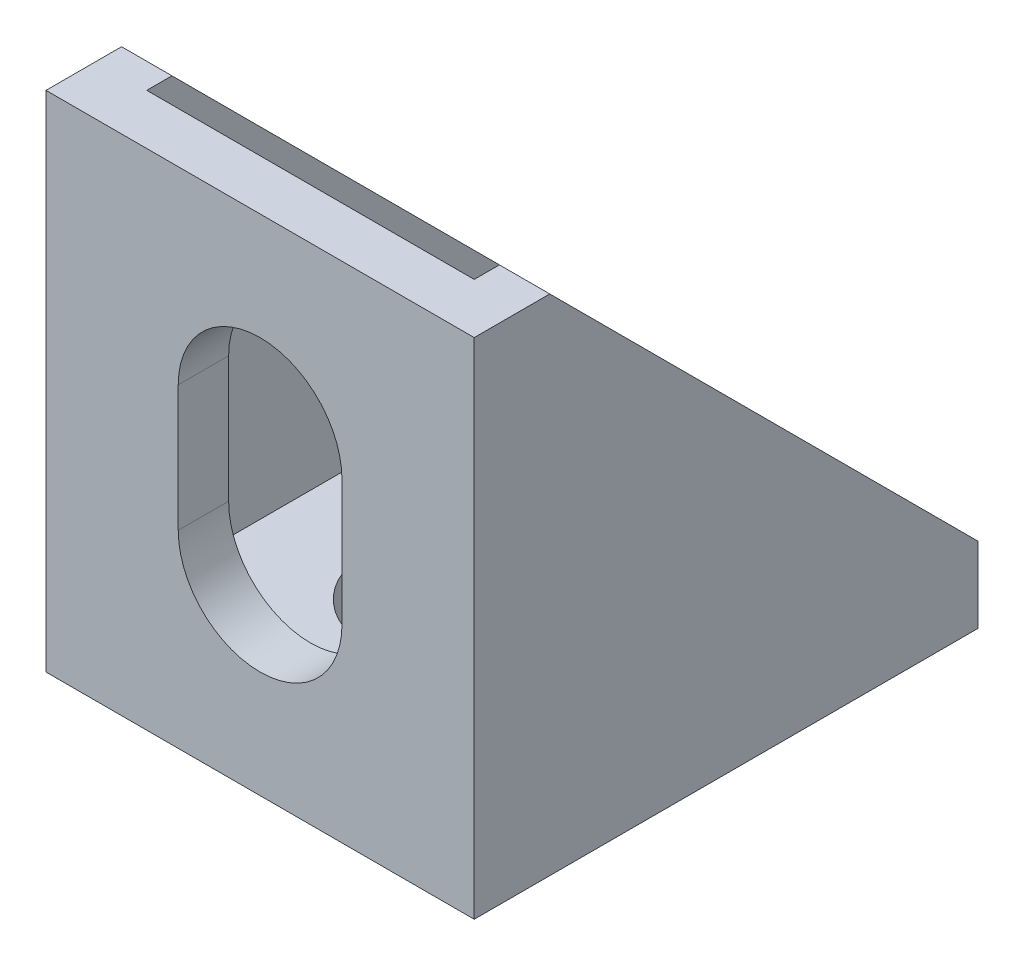
ISO-10303-21;
HEADER;
FILE_DESCRIPTION(('STEP AP214'),'2;1');
FILE_NAME('part.step','',(''),(''),'','','');
FILE_SCHEMA(('AUTOMOTIVE_DESIGN { 1 0 10303 214 1 1 1 1 }'));
ENDSEC;
DATA;
#1=APPLICATION_CONTEXT('core data for automotive mechanical design processes');
#2=APPLICATION_PROTOCOL_DEFINITION('international standard','automotive_design',2000,#1);
#3=PRODUCT_CONTEXT('',#1,'mechanical');
#4=PRODUCT('Part','Part','',(#3));
#5=PRODUCT_RELATED_PRODUCT_CATEGORY('part','',(#4));
#6=PRODUCT_DEFINITION_FORMATION('','',#4);
#7=PRODUCT_DEFINITION_CONTEXT('part definition',#1,'design');
#8=PRODUCT_DEFINITION('design','',#6,#7);
#9=PRODUCT_DEFINITION_SHAPE('','',#8);
#10=(LENGTH_UNIT() NAMED_UNIT(*) SI_UNIT(.MILLI.,.METRE.));
#11=(NAMED_UNIT(*) PLANE_ANGLE_UNIT() SI_UNIT($,.RADIAN.));
#12=(NAMED_UNIT(*) SI_UNIT($,.STERADIAN.) SOLID_ANGLE_UNIT());
#13=UNCERTAINTY_MEASURE_WITH_UNIT(LENGTH_MEASURE(1.E-05),#10,'distance_accuracy_value','');
#14=(GEOMETRIC_REPRESENTATION_CONTEXT(3) GLOBAL_UNCERTAINTY_ASSIGNED_CONTEXT((#13)) GLOBAL_UNIT_ASSIGNED_CONTEXT((#10,
#11,#12)) REPRESENTATION_CONTEXT('',''));
#15=CARTESIAN_POINT('',(0.,0.,0.));
#16=DIRECTION('',(0.,0.,1.));
#17=DIRECTION('',(1.,0.,0.));
#18=AXIS2_PLACEMENT_3D('',#15,#16,#17);
#19=CARTESIAN_POINT('',(8.5,3.,-20.));
#20=DIRECTION('',(0.,-0.707106781186548,0.707106781186548));
#21=DIRECTION('',(0.,-0.707106781186548,-0.707106781186548));
#22=AXIS2_PLACEMENT_3D('',#19,#20,#21);
#23=PLANE('',#22);
#24=DIRECTION('',(-1.,0.,0.));
#25=VECTOR('',#24,1.);
#26=CARTESIAN_POINT('',(8.5,3.,-20.));
#27=LINE('',#26,#25);
#28=CARTESIAN_POINT('',(8.5,3.,-20.));
#29=VERTEX_POINT('',#28);
#30=CARTESIAN_POINT('',(6.5,3.,-20.));
#31=VERTEX_POINT('',#30);
#32=EDGE_CURVE('E278',#29,#31,#27,.T.);
#33=ORIENTED_EDGE('',*,*,#32,.T.);
#34=DIRECTION('',(0.,0.707106781186548,0.707106781186548));
#35=VECTOR('',#34,1.);
#36=CARTESIAN_POINT('',(6.5,3.,-20.));
#37=LINE('',#36,#35);
#38=CARTESIAN_POINT('',(6.5,20.,-3.));
#39=VERTEX_POINT('',#38);
#40=EDGE_CURVE('E251',#31,#39,#37,.T.);
#41=ORIENTED_EDGE('',*,*,#40,.T.);
#42=DIRECTION('',(-1.,0.,0.));
#43=VECTOR('',#42,1.);
#44=CARTESIAN_POINT('',(8.5,20.,-3.));
#45=LINE('',#44,#43);
#46=CARTESIAN_POINT('',(8.5,20.,-3.));
#47=VERTEX_POINT('',#46);
#48=EDGE_CURVE('E12',#47,#39,#45,.T.);
#49=ORIENTED_EDGE('',*,*,#48,.F.);
#50=DIRECTION('',(0.,0.707106781186547,0.707106781186547));
#51=VECTOR('',#50,1.);
#52=CARTESIAN_POINT('',(8.5,3.,-20.));
#53=LINE('',#52,#51);
#54=EDGE_CURVE('E255',#29,#47,#53,.T.);
#55=ORIENTED_EDGE('',*,*,#54,.F.);
#56=EDGE_LOOP('',(#33,#41,#49,#55));
#57=FACE_BOUND('',#56,.T.);
#58=ADVANCED_FACE('F39',(#57),#23,.F.);
#59=CARTESIAN_POINT('',(-6.5,20.,-3.));
#60=VERTEX_POINT('',#59);
#61=CARTESIAN_POINT('',(-8.5,20.,-3.));
#62=VERTEX_POINT('',#61);
#63=EDGE_CURVE('E47',#60,#62,#45,.T.);
#64=ORIENTED_EDGE('',*,*,#63,.F.);
#65=DIRECTION('',(0.,-0.707106781186548,-0.707106781186548));
#66=VECTOR('',#65,1.);
#67=CARTESIAN_POINT('',(-6.5,3.,-20.));
#68=LINE('',#67,#66);
#69=CARTESIAN_POINT('',(-6.5,3.,-20.));
#70=VERTEX_POINT('',#69);
#71=EDGE_CURVE('E248',#60,#70,#68,.T.);
#72=ORIENTED_EDGE('',*,*,#71,.T.);
#73=CARTESIAN_POINT('',(-8.5,3.,-20.));
#74=VERTEX_POINT('',#73);
#75=EDGE_CURVE('E267',#70,#74,#27,.T.);
#76=ORIENTED_EDGE('',*,*,#75,.T.);
#77=DIRECTION('',(0.,0.707106781186547,0.707106781186547));
#78=VECTOR('',#77,1.);
#79=CARTESIAN_POINT('',(-8.5,3.,-20.));
#80=LINE('',#79,#78);
#81=EDGE_CURVE('E254',#74,#62,#80,.T.);
#82=ORIENTED_EDGE('',*,*,#81,.T.);
#83=EDGE_LOOP('',(#64,#72,#76,#82));
#84=FACE_BOUND('',#83,.T.);
#85=ADVANCED_FACE('F41',(#84),#23,.F.);
#86=CARTESIAN_POINT('',(8.5,20.,-3.));
#87=DIRECTION('',(0.,-1.,0.));
#88=DIRECTION('',(0.,0.,-1.));
#89=AXIS2_PLACEMENT_3D('',#86,#87,#88);
#90=PLANE('',#89);
#91=ORIENTED_EDGE('',*,*,#48,.T.);
#92=DIRECTION('',(0.,0.,-1.));
#93=VECTOR('',#92,1.);
#94=CARTESIAN_POINT('',(6.5,20.,21.4009345590327));
#95=LINE('',#94,#93);
#96=CARTESIAN_POINT('',(6.5,20.,-2.));
#97=VERTEX_POINT('',#96);
#98=EDGE_CURVE('E231',#97,#39,#95,.T.);
#99=ORIENTED_EDGE('',*,*,#98,.F.);
#100=DIRECTION('',(-1.,0.,0.));
#101=VECTOR('',#100,1.);
#102=CARTESIAN_POINT('',(6.5,20.,-2.));
#103=LINE('',#102,#101);
#104=CARTESIAN_POINT('',(-6.5,20.,-2.));
#105=VERTEX_POINT('',#104);
#106=EDGE_CURVE('E230',#97,#105,#103,.T.);
#107=ORIENTED_EDGE('',*,*,#106,.T.);
#108=DIRECTION('',(0.,0.,-1.));
#109=VECTOR('',#108,1.);
#110=CARTESIAN_POINT('',(-6.5,20.,21.4009345590327));
#111=LINE('',#110,#109);
#112=EDGE_CURVE('E241',#105,#60,#111,.T.);
#113=ORIENTED_EDGE('',*,*,#112,.T.);
#114=ORIENTED_EDGE('',*,*,#63,.T.);
#115=DIRECTION('',(0.,0.,1.));
#116=VECTOR('',#115,1.);
#117=CARTESIAN_POINT('',(-8.5,20.,-3.));
#118=LINE('',#117,#116);
#119=CARTESIAN_POINT('',(-8.5,20.,0.));
#120=VERTEX_POINT('',#119);
#121=EDGE_CURVE('E270',#62,#120,#118,.T.);
#122=ORIENTED_EDGE('',*,*,#121,.T.);
#123=DIRECTION('',(-1.,0.,0.));
#124=VECTOR('',#123,1.);
#125=CARTESIAN_POINT('',(8.5,20.,0.));
#126=LINE('',#125,#124);
#127=CARTESIAN_POINT('',(8.5,20.,0.));
#128=VERTEX_POINT('',#127);
#129=EDGE_CURVE('E286',#128,#120,#126,.T.);
#130=ORIENTED_EDGE('',*,*,#129,.F.);
#131=DIRECTION('',(0.,0.,1.));
#132=VECTOR('',#131,1.);
#133=CARTESIAN_POINT('',(8.5,20.,-3.));
#134=LINE('',#133,#132);
#135=EDGE_CURVE('E258',#47,#128,#134,.T.);
#136=ORIENTED_EDGE('',*,*,#135,.F.);
#137=EDGE_LOOP('',(#91,#99,#107,#113,#114,#122,#130,#136));
#138=FACE_BOUND('',#137,.T.);
#139=ADVANCED_FACE('F295',(#138),#90,.F.);
#140=CARTESIAN_POINT('',(8.5,20.,0.));
#141=DIRECTION('',(0.,0.,-1.));
#142=DIRECTION('',(0.,1.,0.));
#143=AXIS2_PLACEMENT_3D('',#140,#141,#142);
#144=PLANE('',#143);
#145=DIRECTION('',(0.,-1.,0.));
#146=VECTOR('',#145,1.);
#147=CARTESIAN_POINT('',(3.25,7.5,0.));
#148=LINE('',#147,#146);
#149=CARTESIAN_POINT('',(3.25,12.5,0.));
#150=VERTEX_POINT('',#149);
#151=CARTESIAN_POINT('',(3.25,7.5,0.));
#152=VERTEX_POINT('',#151);
#153=EDGE_CURVE('E206',#150,#152,#148,.T.);
#154=ORIENTED_EDGE('',*,*,#153,.T.);
#155=CARTESIAN_POINT('',(0.,7.5,0.));
#156=DIRECTION('',(0.,0.,-1.));
#157=DIRECTION('',(0.,1.,0.));
#158=AXIS2_PLACEMENT_3D('',#155,#156,#157);
#159=CIRCLE('',#158,3.25);
#160=CARTESIAN_POINT('',(-3.25,7.5,0.));
#161=VERTEX_POINT('',#160);
#162=EDGE_CURVE('E196',#152,#161,#159,.T.);
#163=ORIENTED_EDGE('',*,*,#162,.T.);
#164=DIRECTION('',(0.,1.,0.));
#165=VECTOR('',#164,1.);
#166=CARTESIAN_POINT('',(-3.25,7.5,0.));
#167=LINE('',#166,#165);
#168=CARTESIAN_POINT('',(-3.25,12.5,0.));
#169=VERTEX_POINT('',#168);
#170=EDGE_CURVE('E199',#161,#169,#167,.T.);
#171=ORIENTED_EDGE('',*,*,#170,.T.);
#172=CARTESIAN_POINT('',(0.,12.5,0.));
#173=DIRECTION('',(0.,0.,-1.));
#174=DIRECTION('',(0.,1.,0.));
#175=AXIS2_PLACEMENT_3D('',#172,#173,#174);
#176=CIRCLE('',#175,3.25);
#177=EDGE_CURVE('E203',#169,#150,#176,.T.);
#178=ORIENTED_EDGE('',*,*,#177,.T.);
#179=EDGE_LOOP('',(#154,#163,#171,#178));
#180=FACE_BOUND('',#179,.T.);
#181=DIRECTION('',(0.,-1.,0.));
#182=VECTOR('',#181,1.);
#183=CARTESIAN_POINT('',(-8.5,20.,0.));
#184=LINE('',#183,#182);
#185=CARTESIAN_POINT('',(-8.5,0.,0.));
#186=VERTEX_POINT('',#185);
#187=EDGE_CURVE('E272',#120,#186,#184,.T.);
#188=ORIENTED_EDGE('',*,*,#187,.T.);
#189=DIRECTION('',(-1.,0.,0.));
#190=VECTOR('',#189,1.);
#191=CARTESIAN_POINT('',(8.5,0.,0.));
#192=LINE('',#191,#190);
#193=CARTESIAN_POINT('',(8.5,0.,0.));
#194=VERTEX_POINT('',#193);
#195=EDGE_CURVE('E284',#194,#186,#192,.T.);
#196=ORIENTED_EDGE('',*,*,#195,.F.);
#197=DIRECTION('',(0.,-1.,0.));
#198=VECTOR('',#197,1.);
#199=CARTESIAN_POINT('',(8.5,20.,0.));
#200=LINE('',#199,#198);
#201=EDGE_CURVE('E261',#128,#194,#200,.T.);
#202=ORIENTED_EDGE('',*,*,#201,.F.);
#203=ORIENTED_EDGE('',*,*,#129,.T.);
#204=EDGE_LOOP('',(#188,#196,#202,#203));
#205=FACE_BOUND('',#204,.T.);
#206=ADVANCED_FACE('F313',(#180,#205),#144,.F.);
#207=CARTESIAN_POINT('',(8.5,0.,0.));
#208=DIRECTION('',(0.,1.,0.));
#209=DIRECTION('',(0.,0.,1.));
#210=AXIS2_PLACEMENT_3D('',#207,#208,#209);
#211=PLANE('',#210);
#212=DIRECTION('',(0.,0.,1.));
#213=VECTOR('',#212,1.);
#214=CARTESIAN_POINT('',(-3.25,0.,0.));
#215=LINE('',#214,#213);
#216=CARTESIAN_POINT('',(-3.25,0.,-12.5));
#217=VERTEX_POINT('',#216);
#218=CARTESIAN_POINT('',(-3.25,0.,-7.5));
#219=VERTEX_POINT('',#218);
#220=EDGE_CURVE('E189',#217,#219,#215,.T.);
#221=ORIENTED_EDGE('',*,*,#220,.T.);
#222=CARTESIAN_POINT('',(0.,0.,-7.5));
#223=DIRECTION('',(0.,1.,0.));
#224=DIRECTION('',(0.,0.,1.));
#225=AXIS2_PLACEMENT_3D('',#222,#223,#224);
#226=CIRCLE('',#225,3.25);
#227=CARTESIAN_POINT('',(3.25,0.,-7.5));
#228=VERTEX_POINT('',#227);
#229=EDGE_CURVE('E192',#219,#228,#226,.T.);
#230=ORIENTED_EDGE('',*,*,#229,.T.);
#231=DIRECTION('',(0.,0.,-1.));
#232=VECTOR('',#231,1.);
#233=CARTESIAN_POINT('',(3.25,0.,0.));
#234=LINE('',#233,#232);
#235=CARTESIAN_POINT('',(3.25,0.,-12.5));
#236=VERTEX_POINT('',#235);
#237=EDGE_CURVE('E184',#228,#236,#234,.T.);
#238=ORIENTED_EDGE('',*,*,#237,.T.);
#239=CARTESIAN_POINT('',(0.,0.,-12.5));
#240=DIRECTION('',(0.,1.,0.));
#241=DIRECTION('',(0.,0.,1.));
#242=AXIS2_PLACEMENT_3D('',#239,#240,#241);
#243=CIRCLE('',#242,3.25);
#244=EDGE_CURVE('E164',#236,#217,#243,.T.);
#245=ORIENTED_EDGE('',*,*,#244,.T.);
#246=EDGE_LOOP('',(#221,#230,#238,#245));
#247=FACE_BOUND('',#246,.T.);
#248=DIRECTION('',(0.,0.,-1.));
#249=VECTOR('',#248,1.);
#250=CARTESIAN_POINT('',(-8.5,0.,0.));
#251=LINE('',#250,#249);
#252=CARTESIAN_POINT('',(-8.5,0.,-20.));
#253=VERTEX_POINT('',#252);
#254=EDGE_CURVE('E274',#186,#253,#251,.T.);
#255=ORIENTED_EDGE('',*,*,#254,.T.);
#256=DIRECTION('',(-1.,0.,0.));
#257=VECTOR('',#256,1.);
#258=CARTESIAN_POINT('',(8.5,0.,-20.));
#259=LINE('',#258,#257);
#260=CARTESIAN_POINT('',(8.5,0.,-20.));
#261=VERTEX_POINT('',#260);
#262=EDGE_CURVE('E281',#261,#253,#259,.T.);
#263=ORIENTED_EDGE('',*,*,#262,.F.);
#264=DIRECTION('',(0.,0.,-1.));
#265=VECTOR('',#264,1.);
#266=CARTESIAN_POINT('',(8.5,0.,0.));
#267=LINE('',#266,#265);
#268=EDGE_CURVE('E263',#194,#261,#267,.T.);
#269=ORIENTED_EDGE('',*,*,#268,.F.);
#270=ORIENTED_EDGE('',*,*,#195,.T.);
#271=EDGE_LOOP('',(#255,#263,#269,#270));
#272=FACE_BOUND('',#271,.T.);
#273=ADVANCED_FACE('F310',(#247,#272),#211,.F.);
#274=CARTESIAN_POINT('',(8.5,0.,-20.));
#275=DIRECTION('',(0.,0.,1.));
#276=DIRECTION('',(1.,0.,0.));
#277=AXIS2_PLACEMENT_3D('',#274,#275,#276);
#278=PLANE('',#277);
#279=DIRECTION('',(0.,1.,0.));
#280=VECTOR('',#279,1.);
#281=CARTESIAN_POINT('',(-8.5,0.,-20.));
#282=LINE('',#281,#280);
#283=EDGE_CURVE('E259',#253,#74,#282,.T.);
#284=ORIENTED_EDGE('',*,*,#283,.T.);
#285=ORIENTED_EDGE('',*,*,#75,.F.);
#286=DIRECTION('',(-1.,0.,0.));
#287=VECTOR('',#286,1.);
#288=CARTESIAN_POINT('',(6.5,3.,-20.));
#289=LINE('',#288,#287);
#290=EDGE_CURVE('E221',#31,#70,#289,.T.);
#291=ORIENTED_EDGE('',*,*,#290,.F.);
#292=ORIENTED_EDGE('',*,*,#32,.F.);
#293=DIRECTION('',(0.,1.,0.));
#294=VECTOR('',#293,1.);
#295=CARTESIAN_POINT('',(8.5,0.,-20.));
#296=LINE('',#295,#294);
#297=EDGE_CURVE('E265',#261,#29,#296,.T.);
#298=ORIENTED_EDGE('',*,*,#297,.F.);
#299=ORIENTED_EDGE('',*,*,#262,.T.);
#300=EDGE_LOOP('',(#284,#285,#291,#292,#298,#299));
#301=FACE_BOUND('',#300,.T.);
#302=ADVANCED_FACE('F306',(#301),#278,.F.);
#303=CARTESIAN_POINT('',(8.5,0.,0.));
#304=DIRECTION('',(1.,0.,0.));
#305=DIRECTION('',(0.,0.,-1.));
#306=AXIS2_PLACEMENT_3D('',#303,#304,#305);
#307=PLANE('',#306);
#308=ORIENTED_EDGE('',*,*,#54,.T.);
#309=ORIENTED_EDGE('',*,*,#135,.T.);
#310=ORIENTED_EDGE('',*,*,#201,.T.);
#311=ORIENTED_EDGE('',*,*,#268,.T.);
#312=ORIENTED_EDGE('',*,*,#297,.T.);
#313=EDGE_LOOP('',(#308,#309,#310,#311,#312));
#314=FACE_BOUND('',#313,.T.);
#315=ADVANCED_FACE('F315',(#314),#307,.T.);
#316=CARTESIAN_POINT('',(-8.5,0.,0.));
#317=DIRECTION('',(1.,0.,0.));
#318=DIRECTION('',(0.,0.,-1.));
#319=AXIS2_PLACEMENT_3D('',#316,#317,#318);
#320=PLANE('',#319);
#321=ORIENTED_EDGE('',*,*,#81,.F.);
#322=ORIENTED_EDGE('',*,*,#283,.F.);
#323=ORIENTED_EDGE('',*,*,#254,.F.);
#324=ORIENTED_EDGE('',*,*,#187,.F.);
#325=ORIENTED_EDGE('',*,*,#121,.F.);
#326=EDGE_LOOP('',(#321,#322,#323,#324,#325));
#327=FACE_BOUND('',#326,.T.);
#328=ADVANCED_FACE('F300',(#327),#320,.F.);
#329=CARTESIAN_POINT('',(6.5,3.,21.4009345590327));
#330=DIRECTION('',(1.,0.,0.));
#331=DIRECTION('',(0.,0.,-1.));
#332=AXIS2_PLACEMENT_3D('',#329,#330,#331);
#333=PLANE('',#332);
#334=DIRECTION('',(0.,0.,-1.));
#335=VECTOR('',#334,1.);
#336=CARTESIAN_POINT('',(6.5,3.,21.4009345590327));
#337=LINE('',#336,#335);
#338=CARTESIAN_POINT('',(6.5,3.,-2.));
#339=VERTEX_POINT('',#338);
#340=EDGE_CURVE('E239',#339,#31,#337,.T.);
#341=ORIENTED_EDGE('',*,*,#340,.F.);
#342=DIRECTION('',(0.,1.,0.));
#343=VECTOR('',#342,1.);
#344=CARTESIAN_POINT('',(6.5,3.,-2.));
#345=LINE('',#344,#343);
#346=EDGE_CURVE('E234',#339,#97,#345,.T.);
#347=ORIENTED_EDGE('',*,*,#346,.T.);
#348=ORIENTED_EDGE('',*,*,#98,.T.);
#349=ORIENTED_EDGE('',*,*,#40,.F.);
#350=EDGE_LOOP('',(#341,#347,#348,#349));
#351=FACE_BOUND('',#350,.T.);
#352=ADVANCED_FACE('F324',(#351),#333,.F.);
#353=CARTESIAN_POINT('',(-6.5,3.,21.4009345590327));
#354=DIRECTION('',(-1.,0.,0.));
#355=DIRECTION('',(0.,0.,1.));
#356=AXIS2_PLACEMENT_3D('',#353,#354,#355);
#357=PLANE('',#356);
#358=ORIENTED_EDGE('',*,*,#112,.F.);
#359=DIRECTION('',(0.,-1.,0.));
#360=VECTOR('',#359,1.);
#361=CARTESIAN_POINT('',(-6.5,3.,-2.));
#362=LINE('',#361,#360);
#363=CARTESIAN_POINT('',(-6.5,3.,-2.));
#364=VERTEX_POINT('',#363);
#365=EDGE_CURVE('E228',#105,#364,#362,.T.);
#366=ORIENTED_EDGE('',*,*,#365,.T.);
#367=DIRECTION('',(0.,0.,-1.));
#368=VECTOR('',#367,1.);
#369=CARTESIAN_POINT('',(-6.5,3.,21.4009345590327));
#370=LINE('',#369,#368);
#371=EDGE_CURVE('E244',#364,#70,#370,.T.);
#372=ORIENTED_EDGE('',*,*,#371,.T.);
#373=ORIENTED_EDGE('',*,*,#71,.F.);
#374=EDGE_LOOP('',(#358,#366,#372,#373));
#375=FACE_BOUND('',#374,.T.);
#376=ADVANCED_FACE('F332',(#375),#357,.F.);
#377=CARTESIAN_POINT('',(6.5,3.,21.4009345590327));
#378=DIRECTION('',(0.,-1.,0.));
#379=DIRECTION('',(0.,0.,-1.));
#380=AXIS2_PLACEMENT_3D('',#377,#378,#379);
#381=PLANE('',#380);
#382=DIRECTION('',(0.,0.,-1.));
#383=VECTOR('',#382,1.);
#384=CARTESIAN_POINT('',(3.25,3.,-7.5));
#385=LINE('',#384,#383);
#386=CARTESIAN_POINT('',(3.25,3.,-7.5));
#387=VERTEX_POINT('',#386);
#388=CARTESIAN_POINT('',(3.25,3.,-12.5));
#389=VERTEX_POINT('',#388);
#390=EDGE_CURVE('E170',#387,#389,#385,.T.);
#391=ORIENTED_EDGE('',*,*,#390,.F.);
#392=CARTESIAN_POINT('',(0.,3.,-7.5));
#393=DIRECTION('',(0.,1.,0.));
#394=DIRECTION('',(0.,0.,1.));
#395=AXIS2_PLACEMENT_3D('',#392,#393,#394);
#396=CIRCLE('',#395,3.25);
#397=CARTESIAN_POINT('',(-3.25,3.,-7.5));
#398=VERTEX_POINT('',#397);
#399=EDGE_CURVE('E62',#398,#387,#396,.T.);
#400=ORIENTED_EDGE('',*,*,#399,.F.);
#401=DIRECTION('',(0.,0.,1.));
#402=VECTOR('',#401,1.);
#403=CARTESIAN_POINT('',(-3.25,3.,-7.5));
#404=LINE('',#403,#402);
#405=CARTESIAN_POINT('',(-3.25,3.,-12.5));
#406=VERTEX_POINT('',#405);
#407=EDGE_CURVE('E177',#406,#398,#404,.T.);
#408=ORIENTED_EDGE('',*,*,#407,.F.);
#409=CARTESIAN_POINT('',(0.,3.,-12.5));
#410=DIRECTION('',(0.,1.,0.));
#411=DIRECTION('',(0.,0.,1.));
#412=AXIS2_PLACEMENT_3D('',#409,#410,#411);
#413=CIRCLE('',#412,3.25);
#414=EDGE_CURVE('E161',#389,#406,#413,.T.);
#415=ORIENTED_EDGE('',*,*,#414,.F.);
#416=EDGE_LOOP('',(#391,#400,#408,#415));
#417=FACE_BOUND('',#416,.T.);
#418=DIRECTION('',(1.,0.,0.));
#419=VECTOR('',#418,1.);
#420=CARTESIAN_POINT('',(6.5,3.,-2.));
#421=LINE('',#420,#419);
#422=EDGE_CURVE('E236',#364,#339,#421,.T.);
#423=ORIENTED_EDGE('',*,*,#422,.T.);
#424=ORIENTED_EDGE('',*,*,#340,.T.);
#425=ORIENTED_EDGE('',*,*,#290,.T.);
#426=ORIENTED_EDGE('',*,*,#371,.F.);
#427=EDGE_LOOP('',(#423,#424,#425,#426));
#428=FACE_BOUND('',#427,.T.);
#429=ADVANCED_FACE('F174',(#417,#428),#381,.F.);
#430=CARTESIAN_POINT('',(8.5,20.,-2.));
#431=DIRECTION('',(0.,0.,-1.));
#432=DIRECTION('',(0.,1.,0.));
#433=AXIS2_PLACEMENT_3D('',#430,#431,#432);
#434=PLANE('',#433);
#435=CARTESIAN_POINT('',(0.,7.5,-2.));
#436=DIRECTION('',(0.,0.,-1.));
#437=DIRECTION('',(0.,1.,0.));
#438=AXIS2_PLACEMENT_3D('',#435,#436,#437);
#439=CIRCLE('',#438,3.25);
#440=CARTESIAN_POINT('',(3.25,7.5,-2.));
#441=VERTEX_POINT('',#440);
#442=CARTESIAN_POINT('',(-3.25,7.5,-2.));
#443=VERTEX_POINT('',#442);
#444=EDGE_CURVE('E195',#441,#443,#439,.T.);
#445=ORIENTED_EDGE('',*,*,#444,.F.);
#446=DIRECTION('',(0.,-1.,0.));
#447=VECTOR('',#446,1.);
#448=CARTESIAN_POINT('',(3.25,7.5,-2.));
#449=LINE('',#448,#447);
#450=CARTESIAN_POINT('',(3.25,12.5,-2.));
#451=VERTEX_POINT('',#450);
#452=EDGE_CURVE('E200',#451,#441,#449,.T.);
#453=ORIENTED_EDGE('',*,*,#452,.F.);
#454=CARTESIAN_POINT('',(0.,12.5,-2.));
#455=DIRECTION('',(0.,0.,-1.));
#456=DIRECTION('',(0.,1.,0.));
#457=AXIS2_PLACEMENT_3D('',#454,#455,#456);
#458=CIRCLE('',#457,3.25);
#459=CARTESIAN_POINT('',(-3.25,12.5,-2.));
#460=VERTEX_POINT('',#459);
#461=EDGE_CURVE('E214',#460,#451,#458,.T.);
#462=ORIENTED_EDGE('',*,*,#461,.F.);
#463=DIRECTION('',(0.,1.,0.));
#464=VECTOR('',#463,1.);
#465=CARTESIAN_POINT('',(-3.25,7.5,-2.));
#466=LINE('',#465,#464);
#467=EDGE_CURVE('E211',#443,#460,#466,.T.);
#468=ORIENTED_EDGE('',*,*,#467,.F.);
#469=EDGE_LOOP('',(#445,#453,#462,#468));
#470=FACE_BOUND('',#469,.T.);
#471=ORIENTED_EDGE('',*,*,#346,.F.);
#472=ORIENTED_EDGE('',*,*,#422,.F.);
#473=ORIENTED_EDGE('',*,*,#365,.F.);
#474=ORIENTED_EDGE('',*,*,#106,.F.);
#475=EDGE_LOOP('',(#471,#472,#473,#474));
#476=FACE_BOUND('',#475,.T.);
#477=ADVANCED_FACE('F330',(#470,#476),#434,.T.);
#478=CARTESIAN_POINT('',(0.,7.5,0.));
#479=DIRECTION('',(0.,0.,-1.));
#480=DIRECTION('',(0.,1.,0.));
#481=AXIS2_PLACEMENT_3D('',#478,#479,#480);
#482=CYLINDRICAL_SURFACE('',#481,3.25);
#483=ORIENTED_EDGE('',*,*,#444,.T.);
#484=DIRECTION('',(0.,0.,-1.));
#485=VECTOR('',#484,1.);
#486=CARTESIAN_POINT('',(-3.25,7.5,0.));
#487=LINE('',#486,#485);
#488=EDGE_CURVE('E209',#161,#443,#487,.T.);
#489=ORIENTED_EDGE('',*,*,#488,.F.);
#490=ORIENTED_EDGE('',*,*,#162,.F.);
#491=DIRECTION('',(0.,0.,-1.));
#492=VECTOR('',#491,1.);
#493=CARTESIAN_POINT('',(3.25,7.5,0.));
#494=LINE('',#493,#492);
#495=EDGE_CURVE('E219',#152,#441,#494,.T.);
#496=ORIENTED_EDGE('',*,*,#495,.T.);
#497=EDGE_LOOP('',(#483,#489,#490,#496));
#498=FACE_BOUND('',#497,.T.);
#499=ADVANCED_FACE('F400',(#498),#482,.F.);
#500=CARTESIAN_POINT('',(3.25,7.5,0.));
#501=DIRECTION('',(1.,0.,0.));
#502=DIRECTION('',(0.,1.,0.));
#503=AXIS2_PLACEMENT_3D('',#500,#501,#502);
#504=PLANE('',#503);
#505=ORIENTED_EDGE('',*,*,#452,.T.);
#506=ORIENTED_EDGE('',*,*,#495,.F.);
#507=ORIENTED_EDGE('',*,*,#153,.F.);
#508=DIRECTION('',(0.,0.,-1.));
#509=VECTOR('',#508,1.);
#510=CARTESIAN_POINT('',(3.25,12.5,0.));
#511=LINE('',#510,#509);
#512=EDGE_CURVE('E222',#150,#451,#511,.T.);
#513=ORIENTED_EDGE('',*,*,#512,.T.);
#514=EDGE_LOOP('',(#505,#506,#507,#513));
#515=FACE_BOUND('',#514,.T.);
#516=ADVANCED_FACE('F409',(#515),#504,.F.);
#517=CARTESIAN_POINT('',(0.,12.5,0.));
#518=DIRECTION('',(0.,0.,-1.));
#519=DIRECTION('',(0.,1.,0.));
#520=AXIS2_PLACEMENT_3D('',#517,#518,#519);
#521=CYLINDRICAL_SURFACE('',#520,3.25);
#522=ORIENTED_EDGE('',*,*,#461,.T.);
#523=ORIENTED_EDGE('',*,*,#512,.F.);
#524=ORIENTED_EDGE('',*,*,#177,.F.);
#525=DIRECTION('',(0.,0.,-1.));
#526=VECTOR('',#525,1.);
#527=CARTESIAN_POINT('',(-3.25,12.5,0.));
#528=LINE('',#527,#526);
#529=EDGE_CURVE('E224',#169,#460,#528,.T.);
#530=ORIENTED_EDGE('',*,*,#529,.T.);
#531=EDGE_LOOP('',(#522,#523,#524,#530));
#532=FACE_BOUND('',#531,.T.);
#533=ADVANCED_FACE('F419',(#532),#521,.F.);
#534=CARTESIAN_POINT('',(-3.25,7.5,0.));
#535=DIRECTION('',(-1.,0.,0.));
#536=DIRECTION('',(0.,-1.,0.));
#537=AXIS2_PLACEMENT_3D('',#534,#535,#536);
#538=PLANE('',#537);
#539=ORIENTED_EDGE('',*,*,#467,.T.);
#540=ORIENTED_EDGE('',*,*,#529,.F.);
#541=ORIENTED_EDGE('',*,*,#170,.F.);
#542=ORIENTED_EDGE('',*,*,#488,.T.);
#543=EDGE_LOOP('',(#539,#540,#541,#542));
#544=FACE_BOUND('',#543,.T.);
#545=ADVANCED_FACE('F429',(#544),#538,.F.);
#546=CARTESIAN_POINT('',(0.,-14.,-7.5));
#547=DIRECTION('',(0.,1.,0.));
#548=DIRECTION('',(0.,0.,1.));
#549=AXIS2_PLACEMENT_3D('',#546,#547,#548);
#550=CYLINDRICAL_SURFACE('',#549,3.25);
#551=DIRECTION('',(0.,1.,0.));
#552=VECTOR('',#551,1.);
#553=CARTESIAN_POINT('',(-3.25,-14.,-7.5));
#554=LINE('',#553,#552);
#555=EDGE_CURVE('E182',#219,#398,#554,.T.);
#556=ORIENTED_EDGE('',*,*,#555,.T.);
#557=ORIENTED_EDGE('',*,*,#399,.T.);
#558=DIRECTION('',(0.,1.,0.));
#559=VECTOR('',#558,1.);
#560=CARTESIAN_POINT('',(3.25,-14.,-7.5));
#561=LINE('',#560,#559);
#562=EDGE_CURVE('E167',#228,#387,#561,.T.);
#563=ORIENTED_EDGE('',*,*,#562,.F.);
#564=ORIENTED_EDGE('',*,*,#229,.F.);
#565=EDGE_LOOP('',(#556,#557,#563,#564));
#566=FACE_BOUND('',#565,.T.);
#567=ADVANCED_FACE('F439',(#566),#550,.F.);
#568=CARTESIAN_POINT('',(-3.25,-14.,-7.5));
#569=DIRECTION('',(-1.,0.,0.));
#570=DIRECTION('',(0.,0.,1.));
#571=AXIS2_PLACEMENT_3D('',#568,#569,#570);
#572=PLANE('',#571);
#573=DIRECTION('',(0.,1.,0.));
#574=VECTOR('',#573,1.);
#575=CARTESIAN_POINT('',(-3.25,-14.,-12.5));
#576=LINE('',#575,#574);
#577=EDGE_CURVE('E166',#217,#406,#576,.T.);
#578=ORIENTED_EDGE('',*,*,#577,.T.);
#579=ORIENTED_EDGE('',*,*,#407,.T.);
#580=ORIENTED_EDGE('',*,*,#555,.F.);
#581=ORIENTED_EDGE('',*,*,#220,.F.);
#582=EDGE_LOOP('',(#578,#579,#580,#581));
#583=FACE_BOUND('',#582,.T.);
#584=ADVANCED_FACE('F459',(#583),#572,.F.);
#585=CARTESIAN_POINT('',(0.,-14.,-12.5));
#586=DIRECTION('',(0.,1.,0.));
#587=DIRECTION('',(0.,0.,1.));
#588=AXIS2_PLACEMENT_3D('',#585,#586,#587);
#589=CYLINDRICAL_SURFACE('',#588,3.25);
#590=DIRECTION('',(0.,1.,0.));
#591=VECTOR('',#590,1.);
#592=CARTESIAN_POINT('',(3.25,-14.,-12.5));
#593=LINE('',#592,#591);
#594=EDGE_CURVE('E54',#236,#389,#593,.T.);
#595=ORIENTED_EDGE('',*,*,#594,.T.);
#596=ORIENTED_EDGE('',*,*,#414,.T.);
#597=ORIENTED_EDGE('',*,*,#577,.F.);
#598=ORIENTED_EDGE('',*,*,#244,.F.);
#599=EDGE_LOOP('',(#595,#596,#597,#598));
#600=FACE_BOUND('',#599,.T.);
#601=ADVANCED_FACE('F158',(#600),#589,.F.);
#602=CARTESIAN_POINT('',(3.25,-14.,-7.5));
#603=DIRECTION('',(1.,0.,0.));
#604=DIRECTION('',(0.,0.,-1.));
#605=AXIS2_PLACEMENT_3D('',#602,#603,#604);
#606=PLANE('',#605);
#607=ORIENTED_EDGE('',*,*,#562,.T.);
#608=ORIENTED_EDGE('',*,*,#390,.T.);
#609=ORIENTED_EDGE('',*,*,#594,.F.);
#610=ORIENTED_EDGE('',*,*,#237,.F.);
#611=EDGE_LOOP('',(#607,#608,#609,#610));
#612=FACE_BOUND('',#611,.T.);
#613=ADVANCED_FACE('F171',(#612),#606,.F.);
#614=CLOSED_SHELL('',(#58,#85,#139,#206,#273,#302,#315,#328,#352,#376,#429,#477,#499,#516,#533,
#545,#567,#584,#601,#613));
#615=MANIFOLD_SOLID_BREP('B2',#614);
#616=ADVANCED_BREP_SHAPE_REPRESENTATION('',(#18,#615),#14);
#617=SHAPE_DEFINITION_REPRESENTATION(#9,#616);
ENDSEC;
END-ISO-10303-21;
